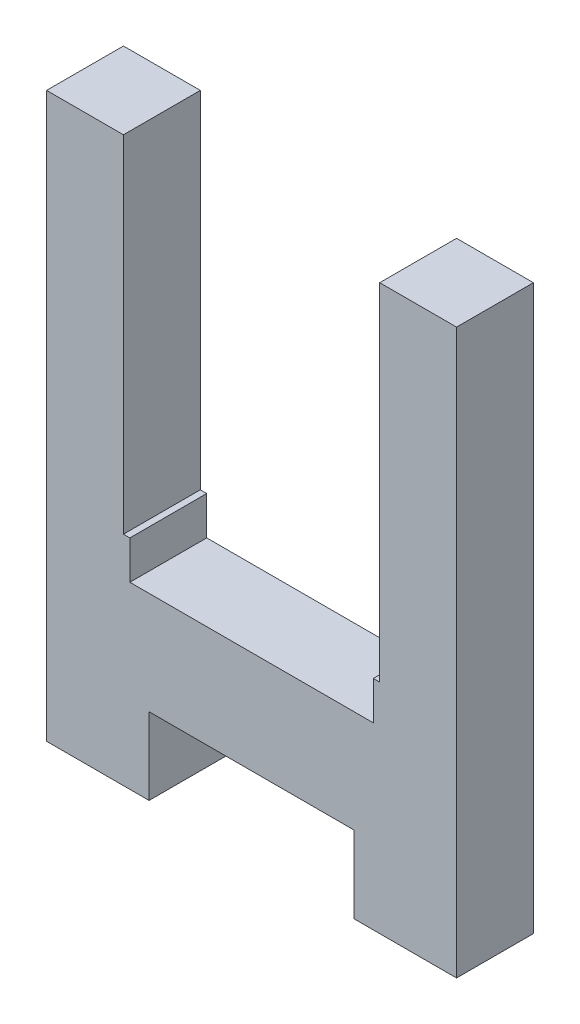
ISO-10303-21;
HEADER;
FILE_DESCRIPTION(('STEP AP214'),'2;1');
FILE_NAME('part.step','',(''),(''),'','','');
FILE_SCHEMA(('AUTOMOTIVE_DESIGN { 1 0 10303 214 1 1 1 1 }'));
ENDSEC;
DATA;
#1=APPLICATION_CONTEXT('core data for automotive mechanical design processes');
#2=APPLICATION_PROTOCOL_DEFINITION('international standard','automotive_design',2000,#1);
#3=PRODUCT_CONTEXT('',#1,'mechanical');
#4=PRODUCT('Part','Part','',(#3));
#5=PRODUCT_RELATED_PRODUCT_CATEGORY('part','',(#4));
#6=PRODUCT_DEFINITION_FORMATION('','',#4);
#7=PRODUCT_DEFINITION_CONTEXT('part definition',#1,'design');
#8=PRODUCT_DEFINITION('design','',#6,#7);
#9=PRODUCT_DEFINITION_SHAPE('','',#8);
#10=(LENGTH_UNIT() NAMED_UNIT(*) SI_UNIT(.MILLI.,.METRE.));
#11=(NAMED_UNIT(*) PLANE_ANGLE_UNIT() SI_UNIT($,.RADIAN.));
#12=(NAMED_UNIT(*) SI_UNIT($,.STERADIAN.) SOLID_ANGLE_UNIT());
#13=UNCERTAINTY_MEASURE_WITH_UNIT(LENGTH_MEASURE(1.E-05),#10,'distance_accuracy_value','');
#14=(GEOMETRIC_REPRESENTATION_CONTEXT(3) GLOBAL_UNCERTAINTY_ASSIGNED_CONTEXT((#13)) GLOBAL_UNIT_ASSIGNED_CONTEXT((#10,
#11,#12)) REPRESENTATION_CONTEXT('',''));
#15=CARTESIAN_POINT('',(0.,0.,0.));
#16=DIRECTION('',(0.,0.,1.));
#17=DIRECTION('',(1.,0.,0.));
#18=AXIS2_PLACEMENT_3D('',#15,#16,#17);
#19=CARTESIAN_POINT('',(-8.,0.,6.));
#20=DIRECTION('',(0.,1.,0.));
#21=DIRECTION('',(0.,0.,1.));
#22=AXIS2_PLACEMENT_3D('',#19,#20,#21);
#23=PLANE('',#22);
#24=DIRECTION('',(1.,0.,0.));
#25=VECTOR('',#24,1.);
#26=CARTESIAN_POINT('',(-8.,0.,0.));
#27=LINE('',#26,#25);
#28=CARTESIAN_POINT('',(-8.,0.,0.));
#29=VERTEX_POINT('',#28);
#30=CARTESIAN_POINT('',(0.,0.,0.));
#31=VERTEX_POINT('',#30);
#32=EDGE_CURVE('E180',#29,#31,#27,.T.);
#33=ORIENTED_EDGE('',*,*,#32,.T.);
#34=DIRECTION('',(0.,0.,-1.));
#35=VECTOR('',#34,1.);
#36=CARTESIAN_POINT('',(0.,0.,6.));
#37=LINE('',#36,#35);
#38=CARTESIAN_POINT('',(0.,0.,6.));
#39=VERTEX_POINT('',#38);
#40=EDGE_CURVE('E11',#39,#31,#37,.T.);
#41=ORIENTED_EDGE('',*,*,#40,.F.);
#42=DIRECTION('',(1.,0.,0.));
#43=VECTOR('',#42,1.);
#44=CARTESIAN_POINT('',(-8.,0.,6.));
#45=LINE('',#44,#43);
#46=CARTESIAN_POINT('',(-8.,0.,6.));
#47=VERTEX_POINT('',#46);
#48=EDGE_CURVE('E210',#47,#39,#45,.T.);
#49=ORIENTED_EDGE('',*,*,#48,.F.);
#50=DIRECTION('',(0.,0.,-1.));
#51=VECTOR('',#50,1.);
#52=CARTESIAN_POINT('',(-8.,0.,6.));
#53=LINE('',#52,#51);
#54=EDGE_CURVE('E176',#47,#29,#53,.T.);
#55=ORIENTED_EDGE('',*,*,#54,.T.);
#56=EDGE_LOOP('',(#33,#41,#49,#55));
#57=FACE_BOUND('',#56,.T.);
#58=ADVANCED_FACE('F36',(#57),#23,.F.);
#59=CARTESIAN_POINT('',(0.,0.,6.));
#60=DIRECTION('',(-1.,0.,0.));
#61=DIRECTION('',(0.,-1.,0.));
#62=AXIS2_PLACEMENT_3D('',#59,#60,#61);
#63=PLANE('',#62);
#64=DIRECTION('',(0.,1.,0.));
#65=VECTOR('',#64,1.);
#66=CARTESIAN_POINT('',(0.,0.,0.));
#67=LINE('',#66,#65);
#68=CARTESIAN_POINT('',(0.,44.,0.));
#69=VERTEX_POINT('',#68);
#70=EDGE_CURVE('E183',#31,#69,#67,.T.);
#71=ORIENTED_EDGE('',*,*,#70,.T.);
#72=DIRECTION('',(0.,0.,-1.));
#73=VECTOR('',#72,1.);
#74=CARTESIAN_POINT('',(0.,44.,6.));
#75=LINE('',#74,#73);
#76=CARTESIAN_POINT('',(0.,44.,6.));
#77=VERTEX_POINT('',#76);
#78=EDGE_CURVE('E44',#77,#69,#75,.T.);
#79=ORIENTED_EDGE('',*,*,#78,.F.);
#80=DIRECTION('',(0.,1.,0.));
#81=VECTOR('',#80,1.);
#82=CARTESIAN_POINT('',(0.,0.,6.));
#83=LINE('',#82,#81);
#84=EDGE_CURVE('E119',#39,#77,#83,.T.);
#85=ORIENTED_EDGE('',*,*,#84,.F.);
#86=ORIENTED_EDGE('',*,*,#40,.T.);
#87=EDGE_LOOP('',(#71,#79,#85,#86));
#88=FACE_BOUND('',#87,.T.);
#89=ADVANCED_FACE('F308',(#88),#63,.F.);
#90=CARTESIAN_POINT('',(0.,44.,6.));
#91=DIRECTION('',(0.,-1.,0.));
#92=DIRECTION('',(0.,0.,-1.));
#93=AXIS2_PLACEMENT_3D('',#90,#91,#92);
#94=PLANE('',#93);
#95=DIRECTION('',(-1.,0.,0.));
#96=VECTOR('',#95,1.);
#97=CARTESIAN_POINT('',(0.,44.,0.));
#98=LINE('',#97,#96);
#99=CARTESIAN_POINT('',(-5.99999999999999,44.,0.));
#100=VERTEX_POINT('',#99);
#101=EDGE_CURVE('E185',#69,#100,#98,.T.);
#102=ORIENTED_EDGE('',*,*,#101,.T.);
#103=DIRECTION('',(0.,0.,-1.));
#104=VECTOR('',#103,1.);
#105=CARTESIAN_POINT('',(-5.99999999999999,44.,6.));
#106=LINE('',#105,#104);
#107=CARTESIAN_POINT('',(-5.99999999999999,44.,6.));
#108=VERTEX_POINT('',#107);
#109=EDGE_CURVE('E241',#108,#100,#106,.T.);
#110=ORIENTED_EDGE('',*,*,#109,.F.);
#111=DIRECTION('',(-1.,0.,0.));
#112=VECTOR('',#111,1.);
#113=CARTESIAN_POINT('',(0.,44.,6.));
#114=LINE('',#113,#112);
#115=EDGE_CURVE('E249',#77,#108,#114,.T.);
#116=ORIENTED_EDGE('',*,*,#115,.F.);
#117=ORIENTED_EDGE('',*,*,#78,.T.);
#118=EDGE_LOOP('',(#102,#110,#116,#117));
#119=FACE_BOUND('',#118,.T.);
#120=ADVANCED_FACE('F247',(#119),#94,.F.);
#121=CARTESIAN_POINT('',(-5.99999999999999,44.,6.));
#122=DIRECTION('',(1.,0.,0.));
#123=DIRECTION('',(0.,1.,0.));
#124=AXIS2_PLACEMENT_3D('',#121,#122,#123);
#125=PLANE('',#124);
#126=DIRECTION('',(0.,-1.,0.));
#127=VECTOR('',#126,1.);
#128=CARTESIAN_POINT('',(-5.99999999999999,44.,0.));
#129=LINE('',#128,#127);
#130=CARTESIAN_POINT('',(-6.,17.,0.));
#131=VERTEX_POINT('',#130);
#132=EDGE_CURVE('E187',#100,#131,#129,.T.);
#133=ORIENTED_EDGE('',*,*,#132,.T.);
#134=DIRECTION('',(0.,0.,-1.));
#135=VECTOR('',#134,1.);
#136=CARTESIAN_POINT('',(-6.,17.,6.));
#137=LINE('',#136,#135);
#138=CARTESIAN_POINT('',(-6.,17.,6.));
#139=VERTEX_POINT('',#138);
#140=EDGE_CURVE('E238',#139,#131,#137,.T.);
#141=ORIENTED_EDGE('',*,*,#140,.F.);
#142=DIRECTION('',(0.,-1.,0.));
#143=VECTOR('',#142,1.);
#144=CARTESIAN_POINT('',(-5.99999999999999,44.,6.));
#145=LINE('',#144,#143);
#146=EDGE_CURVE('E267',#108,#139,#145,.T.);
#147=ORIENTED_EDGE('',*,*,#146,.F.);
#148=ORIENTED_EDGE('',*,*,#109,.T.);
#149=EDGE_LOOP('',(#133,#141,#147,#148));
#150=FACE_BOUND('',#149,.T.);
#151=ADVANCED_FACE('F258',(#150),#125,.F.);
#152=CARTESIAN_POINT('',(-6.,17.,6.));
#153=DIRECTION('',(0.,-1.,0.));
#154=DIRECTION('',(0.,0.,-1.));
#155=AXIS2_PLACEMENT_3D('',#152,#153,#154);
#156=PLANE('',#155);
#157=DIRECTION('',(-1.,0.,0.));
#158=VECTOR('',#157,1.);
#159=CARTESIAN_POINT('',(-6.,17.,0.));
#160=LINE('',#159,#158);
#161=CARTESIAN_POINT('',(-6.5,17.,0.));
#162=VERTEX_POINT('',#161);
#163=EDGE_CURVE('E189',#131,#162,#160,.T.);
#164=ORIENTED_EDGE('',*,*,#163,.T.);
#165=DIRECTION('',(0.,0.,-1.));
#166=VECTOR('',#165,1.);
#167=CARTESIAN_POINT('',(-6.5,17.,6.));
#168=LINE('',#167,#166);
#169=CARTESIAN_POINT('',(-6.5,17.,6.));
#170=VERTEX_POINT('',#169);
#171=EDGE_CURVE('E235',#170,#162,#168,.T.);
#172=ORIENTED_EDGE('',*,*,#171,.F.);
#173=DIRECTION('',(-1.,0.,0.));
#174=VECTOR('',#173,1.);
#175=CARTESIAN_POINT('',(-6.,17.,6.));
#176=LINE('',#175,#174);
#177=EDGE_CURVE('E264',#139,#170,#176,.T.);
#178=ORIENTED_EDGE('',*,*,#177,.F.);
#179=ORIENTED_EDGE('',*,*,#140,.T.);
#180=EDGE_LOOP('',(#164,#172,#178,#179));
#181=FACE_BOUND('',#180,.T.);
#182=ADVANCED_FACE('F262',(#181),#156,.F.);
#183=CARTESIAN_POINT('',(-6.5,17.,6.));
#184=DIRECTION('',(1.,0.,0.));
#185=DIRECTION('',(0.,1.,0.));
#186=AXIS2_PLACEMENT_3D('',#183,#184,#185);
#187=PLANE('',#186);
#188=DIRECTION('',(0.,-1.,0.));
#189=VECTOR('',#188,1.);
#190=CARTESIAN_POINT('',(-6.5,17.,0.));
#191=LINE('',#190,#189);
#192=CARTESIAN_POINT('',(-6.49999999999999,14.,0.));
#193=VERTEX_POINT('',#192);
#194=EDGE_CURVE('E191',#162,#193,#191,.T.);
#195=ORIENTED_EDGE('',*,*,#194,.T.);
#196=DIRECTION('',(0.,0.,-1.));
#197=VECTOR('',#196,1.);
#198=CARTESIAN_POINT('',(-6.49999999999999,14.,6.));
#199=LINE('',#198,#197);
#200=CARTESIAN_POINT('',(-6.49999999999999,14.,6.));
#201=VERTEX_POINT('',#200);
#202=EDGE_CURVE('E232',#201,#193,#199,.T.);
#203=ORIENTED_EDGE('',*,*,#202,.F.);
#204=DIRECTION('',(0.,-1.,0.));
#205=VECTOR('',#204,1.);
#206=CARTESIAN_POINT('',(-6.5,17.,6.));
#207=LINE('',#206,#205);
#208=EDGE_CURVE('E266',#170,#201,#207,.T.);
#209=ORIENTED_EDGE('',*,*,#208,.F.);
#210=ORIENTED_EDGE('',*,*,#171,.T.);
#211=EDGE_LOOP('',(#195,#203,#209,#210));
#212=FACE_BOUND('',#211,.T.);
#213=ADVANCED_FACE('F321',(#212),#187,.F.);
#214=CARTESIAN_POINT('',(-6.49999999999999,14.,6.));
#215=DIRECTION('',(0.,-1.,0.));
#216=DIRECTION('',(1.,0.,0.));
#217=AXIS2_PLACEMENT_3D('',#214,#215,#216);
#218=PLANE('',#217);
#219=DIRECTION('',(-1.,0.,0.));
#220=VECTOR('',#219,1.);
#221=CARTESIAN_POINT('',(-6.49999999999999,14.,0.));
#222=LINE('',#221,#220);
#223=CARTESIAN_POINT('',(-25.5,14.,0.));
#224=VERTEX_POINT('',#223);
#225=EDGE_CURVE('E193',#193,#224,#222,.T.);
#226=ORIENTED_EDGE('',*,*,#225,.T.);
#227=DIRECTION('',(0.,0.,-1.));
#228=VECTOR('',#227,1.);
#229=CARTESIAN_POINT('',(-25.5,14.,6.));
#230=LINE('',#229,#228);
#231=CARTESIAN_POINT('',(-25.5,14.,6.));
#232=VERTEX_POINT('',#231);
#233=EDGE_CURVE('E229',#232,#224,#230,.T.);
#234=ORIENTED_EDGE('',*,*,#233,.F.);
#235=DIRECTION('',(-1.,0.,0.));
#236=VECTOR('',#235,1.);
#237=CARTESIAN_POINT('',(-6.49999999999999,14.,6.));
#238=LINE('',#237,#236);
#239=EDGE_CURVE('E269',#201,#232,#238,.T.);
#240=ORIENTED_EDGE('',*,*,#239,.F.);
#241=ORIENTED_EDGE('',*,*,#202,.T.);
#242=EDGE_LOOP('',(#226,#234,#240,#241));
#243=FACE_BOUND('',#242,.T.);
#244=ADVANCED_FACE('F324',(#243),#218,.F.);
#245=CARTESIAN_POINT('',(-25.5,14.,6.));
#246=DIRECTION('',(-1.,0.,0.));
#247=DIRECTION('',(0.,-1.,0.));
#248=AXIS2_PLACEMENT_3D('',#245,#246,#247);
#249=PLANE('',#248);
#250=DIRECTION('',(0.,1.,0.));
#251=VECTOR('',#250,1.);
#252=CARTESIAN_POINT('',(-25.5,14.,0.));
#253=LINE('',#252,#251);
#254=CARTESIAN_POINT('',(-25.5,17.,0.));
#255=VERTEX_POINT('',#254);
#256=EDGE_CURVE('E195',#224,#255,#253,.T.);
#257=ORIENTED_EDGE('',*,*,#256,.T.);
#258=DIRECTION('',(0.,0.,-1.));
#259=VECTOR('',#258,1.);
#260=CARTESIAN_POINT('',(-25.5,17.,6.));
#261=LINE('',#260,#259);
#262=CARTESIAN_POINT('',(-25.5,17.,6.));
#263=VERTEX_POINT('',#262);
#264=EDGE_CURVE('E226',#263,#255,#261,.T.);
#265=ORIENTED_EDGE('',*,*,#264,.F.);
#266=DIRECTION('',(0.,1.,0.));
#267=VECTOR('',#266,1.);
#268=CARTESIAN_POINT('',(-25.5,14.,6.));
#269=LINE('',#268,#267);
#270=EDGE_CURVE('E275',#232,#263,#269,.T.);
#271=ORIENTED_EDGE('',*,*,#270,.F.);
#272=ORIENTED_EDGE('',*,*,#233,.T.);
#273=EDGE_LOOP('',(#257,#265,#271,#272));
#274=FACE_BOUND('',#273,.T.);
#275=ADVANCED_FACE('F328',(#274),#249,.F.);
#276=CARTESIAN_POINT('',(-25.5,17.,6.));
#277=DIRECTION('',(0.,-1.,0.));
#278=DIRECTION('',(0.,0.,-1.));
#279=AXIS2_PLACEMENT_3D('',#276,#277,#278);
#280=PLANE('',#279);
#281=DIRECTION('',(-1.,0.,0.));
#282=VECTOR('',#281,1.);
#283=CARTESIAN_POINT('',(-25.5,17.,0.));
#284=LINE('',#283,#282);
#285=CARTESIAN_POINT('',(-26.,17.,0.));
#286=VERTEX_POINT('',#285);
#287=EDGE_CURVE('E197',#255,#286,#284,.T.);
#288=ORIENTED_EDGE('',*,*,#287,.T.);
#289=DIRECTION('',(0.,0.,-1.));
#290=VECTOR('',#289,1.);
#291=CARTESIAN_POINT('',(-26.,17.,6.));
#292=LINE('',#291,#290);
#293=CARTESIAN_POINT('',(-26.,17.,6.));
#294=VERTEX_POINT('',#293);
#295=EDGE_CURVE('E223',#294,#286,#292,.T.);
#296=ORIENTED_EDGE('',*,*,#295,.F.);
#297=DIRECTION('',(-1.,0.,0.));
#298=VECTOR('',#297,1.);
#299=CARTESIAN_POINT('',(-25.5,17.,6.));
#300=LINE('',#299,#298);
#301=EDGE_CURVE('E277',#263,#294,#300,.T.);
#302=ORIENTED_EDGE('',*,*,#301,.F.);
#303=ORIENTED_EDGE('',*,*,#264,.T.);
#304=EDGE_LOOP('',(#288,#296,#302,#303));
#305=FACE_BOUND('',#304,.T.);
#306=ADVANCED_FACE('F332',(#305),#280,.F.);
#307=CARTESIAN_POINT('',(-26.,17.,6.));
#308=DIRECTION('',(-1.,0.,0.));
#309=DIRECTION('',(0.,-1.,0.));
#310=AXIS2_PLACEMENT_3D('',#307,#308,#309);
#311=PLANE('',#310);
#312=DIRECTION('',(0.,1.,0.));
#313=VECTOR('',#312,1.);
#314=CARTESIAN_POINT('',(-26.,17.,0.));
#315=LINE('',#314,#313);
#316=CARTESIAN_POINT('',(-26.,44.,0.));
#317=VERTEX_POINT('',#316);
#318=EDGE_CURVE('E199',#286,#317,#315,.T.);
#319=ORIENTED_EDGE('',*,*,#318,.T.);
#320=DIRECTION('',(0.,0.,-1.));
#321=VECTOR('',#320,1.);
#322=CARTESIAN_POINT('',(-26.,44.,6.));
#323=LINE('',#322,#321);
#324=CARTESIAN_POINT('',(-26.,44.,6.));
#325=VERTEX_POINT('',#324);
#326=EDGE_CURVE('E220',#325,#317,#323,.T.);
#327=ORIENTED_EDGE('',*,*,#326,.F.);
#328=DIRECTION('',(0.,1.,0.));
#329=VECTOR('',#328,1.);
#330=CARTESIAN_POINT('',(-26.,17.,6.));
#331=LINE('',#330,#329);
#332=EDGE_CURVE('E279',#294,#325,#331,.T.);
#333=ORIENTED_EDGE('',*,*,#332,.F.);
#334=ORIENTED_EDGE('',*,*,#295,.T.);
#335=EDGE_LOOP('',(#319,#327,#333,#334));
#336=FACE_BOUND('',#335,.T.);
#337=ADVANCED_FACE('F336',(#336),#311,.F.);
#338=CARTESIAN_POINT('',(-26.,44.,6.));
#339=DIRECTION('',(0.,-1.,0.));
#340=DIRECTION('',(1.,0.,0.));
#341=AXIS2_PLACEMENT_3D('',#338,#339,#340);
#342=PLANE('',#341);
#343=DIRECTION('',(-1.,0.,0.));
#344=VECTOR('',#343,1.);
#345=CARTESIAN_POINT('',(-26.,44.,0.));
#346=LINE('',#345,#344);
#347=CARTESIAN_POINT('',(-32.,44.,0.));
#348=VERTEX_POINT('',#347);
#349=EDGE_CURVE('E201',#317,#348,#346,.T.);
#350=ORIENTED_EDGE('',*,*,#349,.T.);
#351=DIRECTION('',(0.,0.,-1.));
#352=VECTOR('',#351,1.);
#353=CARTESIAN_POINT('',(-32.,44.,6.));
#354=LINE('',#353,#352);
#355=CARTESIAN_POINT('',(-32.,44.,6.));
#356=VERTEX_POINT('',#355);
#357=EDGE_CURVE('E217',#356,#348,#354,.T.);
#358=ORIENTED_EDGE('',*,*,#357,.F.);
#359=DIRECTION('',(-1.,0.,0.));
#360=VECTOR('',#359,1.);
#361=CARTESIAN_POINT('',(-26.,44.,6.));
#362=LINE('',#361,#360);
#363=EDGE_CURVE('E281',#325,#356,#362,.T.);
#364=ORIENTED_EDGE('',*,*,#363,.F.);
#365=ORIENTED_EDGE('',*,*,#326,.T.);
#366=EDGE_LOOP('',(#350,#358,#364,#365));
#367=FACE_BOUND('',#366,.T.);
#368=ADVANCED_FACE('F340',(#367),#342,.F.);
#369=CARTESIAN_POINT('',(-32.,44.,6.));
#370=DIRECTION('',(1.,0.,0.));
#371=DIRECTION('',(0.,0.,-1.));
#372=AXIS2_PLACEMENT_3D('',#369,#370,#371);
#373=PLANE('',#372);
#374=DIRECTION('',(0.,-1.,0.));
#375=VECTOR('',#374,1.);
#376=CARTESIAN_POINT('',(-32.,44.,0.));
#377=LINE('',#376,#375);
#378=CARTESIAN_POINT('',(-32.,0.,0.));
#379=VERTEX_POINT('',#378);
#380=EDGE_CURVE('E203',#348,#379,#377,.T.);
#381=ORIENTED_EDGE('',*,*,#380,.T.);
#382=DIRECTION('',(0.,0.,-1.));
#383=VECTOR('',#382,1.);
#384=CARTESIAN_POINT('',(-32.,0.,6.));
#385=LINE('',#384,#383);
#386=CARTESIAN_POINT('',(-32.,0.,6.));
#387=VERTEX_POINT('',#386);
#388=EDGE_CURVE('E214',#387,#379,#385,.T.);
#389=ORIENTED_EDGE('',*,*,#388,.F.);
#390=DIRECTION('',(0.,-1.,0.));
#391=VECTOR('',#390,1.);
#392=CARTESIAN_POINT('',(-32.,44.,6.));
#393=LINE('',#392,#391);
#394=EDGE_CURVE('E283',#356,#387,#393,.T.);
#395=ORIENTED_EDGE('',*,*,#394,.F.);
#396=ORIENTED_EDGE('',*,*,#357,.T.);
#397=EDGE_LOOP('',(#381,#389,#395,#396));
#398=FACE_BOUND('',#397,.T.);
#399=ADVANCED_FACE('F289',(#398),#373,.F.);
#400=CARTESIAN_POINT('',(-32.,0.,6.));
#401=DIRECTION('',(0.,1.,0.));
#402=DIRECTION('',(0.,0.,1.));
#403=AXIS2_PLACEMENT_3D('',#400,#401,#402);
#404=PLANE('',#403);
#405=DIRECTION('',(1.,0.,0.));
#406=VECTOR('',#405,1.);
#407=CARTESIAN_POINT('',(-32.,0.,0.));
#408=LINE('',#407,#406);
#409=CARTESIAN_POINT('',(-24.,0.,0.));
#410=VERTEX_POINT('',#409);
#411=EDGE_CURVE('E205',#379,#410,#408,.T.);
#412=ORIENTED_EDGE('',*,*,#411,.T.);
#413=DIRECTION('',(0.,0.,-1.));
#414=VECTOR('',#413,1.);
#415=CARTESIAN_POINT('',(-24.,0.,6.));
#416=LINE('',#415,#414);
#417=CARTESIAN_POINT('',(-24.,0.,6.));
#418=VERTEX_POINT('',#417);
#419=EDGE_CURVE('E171',#418,#410,#416,.T.);
#420=ORIENTED_EDGE('',*,*,#419,.F.);
#421=DIRECTION('',(1.,0.,0.));
#422=VECTOR('',#421,1.);
#423=CARTESIAN_POINT('',(-32.,0.,6.));
#424=LINE('',#423,#422);
#425=EDGE_CURVE('E162',#387,#418,#424,.T.);
#426=ORIENTED_EDGE('',*,*,#425,.F.);
#427=ORIENTED_EDGE('',*,*,#388,.T.);
#428=EDGE_LOOP('',(#412,#420,#426,#427));
#429=FACE_BOUND('',#428,.T.);
#430=ADVANCED_FACE('F293',(#429),#404,.F.);
#431=CARTESIAN_POINT('',(-24.,0.,6.));
#432=DIRECTION('',(-1.,0.,0.));
#433=DIRECTION('',(0.,0.,1.));
#434=AXIS2_PLACEMENT_3D('',#431,#432,#433);
#435=PLANE('',#434);
#436=DIRECTION('',(0.,1.,0.));
#437=VECTOR('',#436,1.);
#438=CARTESIAN_POINT('',(-24.,0.,0.));
#439=LINE('',#438,#437);
#440=CARTESIAN_POINT('',(-24.,6.,0.));
#441=VERTEX_POINT('',#440);
#442=EDGE_CURVE('E170',#410,#441,#439,.T.);
#443=ORIENTED_EDGE('',*,*,#442,.T.);
#444=DIRECTION('',(0.,0.,-1.));
#445=VECTOR('',#444,1.);
#446=CARTESIAN_POINT('',(-24.,6.,6.));
#447=LINE('',#446,#445);
#448=CARTESIAN_POINT('',(-24.,6.,6.));
#449=VERTEX_POINT('',#448);
#450=EDGE_CURVE('E167',#449,#441,#447,.T.);
#451=ORIENTED_EDGE('',*,*,#450,.F.);
#452=DIRECTION('',(0.,1.,0.));
#453=VECTOR('',#452,1.);
#454=CARTESIAN_POINT('',(-24.,0.,6.));
#455=LINE('',#454,#453);
#456=EDGE_CURVE('E156',#418,#449,#455,.T.);
#457=ORIENTED_EDGE('',*,*,#456,.F.);
#458=ORIENTED_EDGE('',*,*,#419,.T.);
#459=EDGE_LOOP('',(#443,#451,#457,#458));
#460=FACE_BOUND('',#459,.T.);
#461=ADVANCED_FACE('F168',(#460),#435,.F.);
#462=CARTESIAN_POINT('',(-24.,6.,6.));
#463=DIRECTION('',(0.,1.,0.));
#464=DIRECTION('',(0.,0.,1.));
#465=AXIS2_PLACEMENT_3D('',#462,#463,#464);
#466=PLANE('',#465);
#467=DIRECTION('',(1.,0.,0.));
#468=VECTOR('',#467,1.);
#469=CARTESIAN_POINT('',(-24.,6.,0.));
#470=LINE('',#469,#468);
#471=CARTESIAN_POINT('',(-8.,6.,0.));
#472=VERTEX_POINT('',#471);
#473=EDGE_CURVE('E105',#441,#472,#470,.T.);
#474=ORIENTED_EDGE('',*,*,#473,.T.);
#475=DIRECTION('',(0.,0.,-1.));
#476=VECTOR('',#475,1.);
#477=CARTESIAN_POINT('',(-8.,6.,6.));
#478=LINE('',#477,#476);
#479=CARTESIAN_POINT('',(-8.,6.,6.));
#480=VERTEX_POINT('',#479);
#481=EDGE_CURVE('E172',#480,#472,#478,.T.);
#482=ORIENTED_EDGE('',*,*,#481,.F.);
#483=DIRECTION('',(1.,0.,0.));
#484=VECTOR('',#483,1.);
#485=CARTESIAN_POINT('',(-24.,6.,6.));
#486=LINE('',#485,#484);
#487=EDGE_CURVE('E160',#449,#480,#486,.T.);
#488=ORIENTED_EDGE('',*,*,#487,.F.);
#489=ORIENTED_EDGE('',*,*,#450,.T.);
#490=EDGE_LOOP('',(#474,#482,#488,#489));
#491=FACE_BOUND('',#490,.T.);
#492=ADVANCED_FACE('F174',(#491),#466,.F.);
#493=CARTESIAN_POINT('',(-8.,6.,6.));
#494=DIRECTION('',(1.,0.,0.));
#495=DIRECTION('',(0.,0.,-1.));
#496=AXIS2_PLACEMENT_3D('',#493,#494,#495);
#497=PLANE('',#496);
#498=DIRECTION('',(0.,-1.,0.));
#499=VECTOR('',#498,1.);
#500=CARTESIAN_POINT('',(-8.,6.,0.));
#501=LINE('',#500,#499);
#502=EDGE_CURVE('E111',#472,#29,#501,.T.);
#503=ORIENTED_EDGE('',*,*,#502,.T.);
#504=ORIENTED_EDGE('',*,*,#54,.F.);
#505=DIRECTION('',(0.,-1.,0.));
#506=VECTOR('',#505,1.);
#507=CARTESIAN_POINT('',(-8.,6.,6.));
#508=LINE('',#507,#506);
#509=EDGE_CURVE('E52',#480,#47,#508,.T.);
#510=ORIENTED_EDGE('',*,*,#509,.F.);
#511=ORIENTED_EDGE('',*,*,#481,.T.);
#512=EDGE_LOOP('',(#503,#504,#510,#511));
#513=FACE_BOUND('',#512,.T.);
#514=ADVANCED_FACE('F297',(#513),#497,.F.);
#515=CARTESIAN_POINT('',(0.,0.,6.));
#516=DIRECTION('',(0.,0.,1.));
#517=DIRECTION('',(1.,0.,0.));
#518=AXIS2_PLACEMENT_3D('',#515,#516,#517);
#519=PLANE('',#518);
#520=ORIENTED_EDGE('',*,*,#48,.T.);
#521=ORIENTED_EDGE('',*,*,#84,.T.);
#522=ORIENTED_EDGE('',*,*,#115,.T.);
#523=ORIENTED_EDGE('',*,*,#146,.T.);
#524=ORIENTED_EDGE('',*,*,#177,.T.);
#525=ORIENTED_EDGE('',*,*,#208,.T.);
#526=ORIENTED_EDGE('',*,*,#239,.T.);
#527=ORIENTED_EDGE('',*,*,#270,.T.);
#528=ORIENTED_EDGE('',*,*,#301,.T.);
#529=ORIENTED_EDGE('',*,*,#332,.T.);
#530=ORIENTED_EDGE('',*,*,#363,.T.);
#531=ORIENTED_EDGE('',*,*,#394,.T.);
#532=ORIENTED_EDGE('',*,*,#425,.T.);
#533=ORIENTED_EDGE('',*,*,#456,.T.);
#534=ORIENTED_EDGE('',*,*,#487,.T.);
#535=ORIENTED_EDGE('',*,*,#509,.T.);
#536=EDGE_LOOP('',(#520,#521,#522,#523,#524,#525,#526,#527,#528,#529,#530,#531,#532,#533,#534,#535));
#537=FACE_BOUND('',#536,.T.);
#538=ADVANCED_FACE('F158',(#537),#519,.T.);
#539=CARTESIAN_POINT('',(0.,0.,0.));
#540=DIRECTION('',(0.,0.,1.));
#541=DIRECTION('',(1.,0.,0.));
#542=AXIS2_PLACEMENT_3D('',#539,#540,#541);
#543=PLANE('',#542);
#544=ORIENTED_EDGE('',*,*,#32,.F.);
#545=ORIENTED_EDGE('',*,*,#502,.F.);
#546=ORIENTED_EDGE('',*,*,#473,.F.);
#547=ORIENTED_EDGE('',*,*,#442,.F.);
#548=ORIENTED_EDGE('',*,*,#411,.F.);
#549=ORIENTED_EDGE('',*,*,#380,.F.);
#550=ORIENTED_EDGE('',*,*,#349,.F.);
#551=ORIENTED_EDGE('',*,*,#318,.F.);
#552=ORIENTED_EDGE('',*,*,#287,.F.);
#553=ORIENTED_EDGE('',*,*,#256,.F.);
#554=ORIENTED_EDGE('',*,*,#225,.F.);
#555=ORIENTED_EDGE('',*,*,#194,.F.);
#556=ORIENTED_EDGE('',*,*,#163,.F.);
#557=ORIENTED_EDGE('',*,*,#132,.F.);
#558=ORIENTED_EDGE('',*,*,#101,.F.);
#559=ORIENTED_EDGE('',*,*,#70,.F.);
#560=EDGE_LOOP('',(#544,#545,#546,#547,#548,#549,#550,#551,#552,#553,#554,#555,#556,#557,#558,#559));
#561=FACE_BOUND('',#560,.T.);
#562=ADVANCED_FACE('F253',(#561),#543,.F.);
#563=CLOSED_SHELL('',(#58,#89,#120,#151,#182,#213,#244,#275,#306,#337,#368,#399,#430,#461,#492,
#514,#538,#562));
#564=MANIFOLD_SOLID_BREP('B2',#563);
#565=ADVANCED_BREP_SHAPE_REPRESENTATION('',(#18,#564),#14);
#566=SHAPE_DEFINITION_REPRESENTATION(#9,#565);
ENDSEC;
END-ISO-10303-21;
